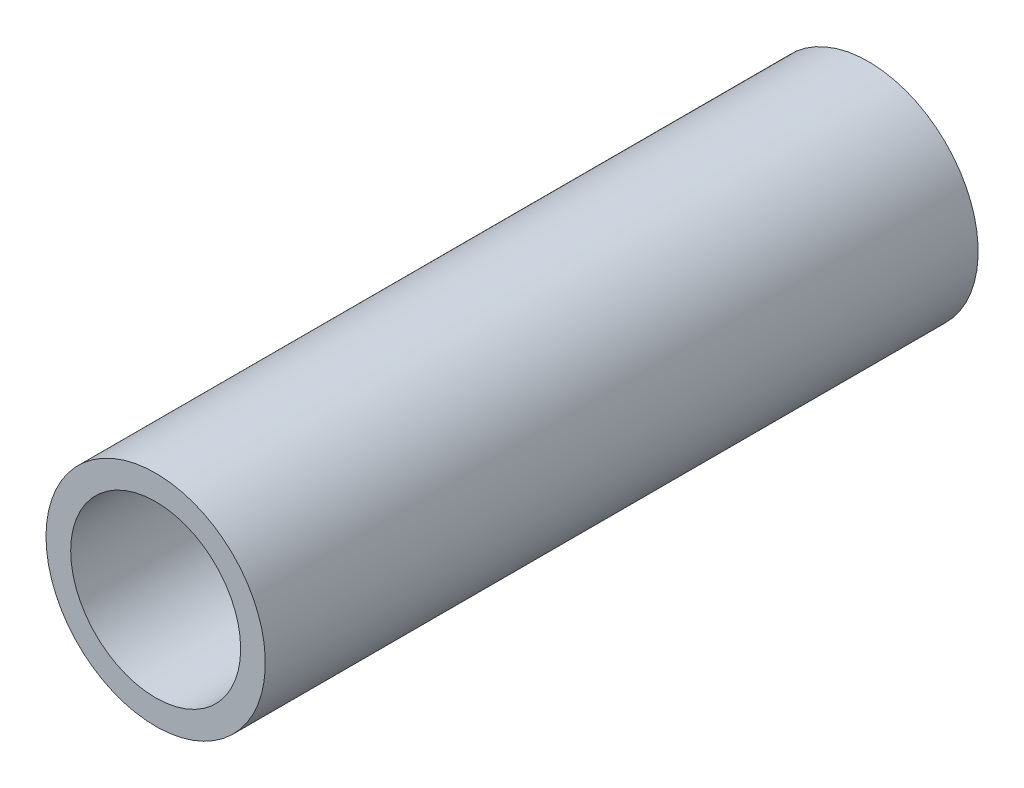
ISO-10303-21;
HEADER;
FILE_DESCRIPTION(('STEP AP214'),'2;1');
FILE_NAME('part.step','',(''),(''),'','','');
FILE_SCHEMA(('AUTOMOTIVE_DESIGN { 1 0 10303 214 1 1 1 1 }'));
ENDSEC;
DATA;
#1=APPLICATION_CONTEXT('core data for automotive mechanical design processes');
#2=APPLICATION_PROTOCOL_DEFINITION('international standard','automotive_design',2000,#1);
#3=PRODUCT_CONTEXT('',#1,'mechanical');
#4=PRODUCT('Part','Part','',(#3));
#5=PRODUCT_RELATED_PRODUCT_CATEGORY('part','',(#4));
#6=PRODUCT_DEFINITION_FORMATION('','',#4);
#7=PRODUCT_DEFINITION_CONTEXT('part definition',#1,'design');
#8=PRODUCT_DEFINITION('design','',#6,#7);
#9=PRODUCT_DEFINITION_SHAPE('','',#8);
#10=(LENGTH_UNIT() NAMED_UNIT(*) SI_UNIT(.MILLI.,.METRE.));
#11=(NAMED_UNIT(*) PLANE_ANGLE_UNIT() SI_UNIT($,.RADIAN.));
#12=(NAMED_UNIT(*) SI_UNIT($,.STERADIAN.) SOLID_ANGLE_UNIT());
#13=UNCERTAINTY_MEASURE_WITH_UNIT(LENGTH_MEASURE(1.E-05),#10,'distance_accuracy_value','');
#14=(GEOMETRIC_REPRESENTATION_CONTEXT(3) GLOBAL_UNCERTAINTY_ASSIGNED_CONTEXT((#13)) GLOBAL_UNIT_ASSIGNED_CONTEXT((#10,
#11,#12)) REPRESENTATION_CONTEXT('',''));
#15=CARTESIAN_POINT('',(0.,0.,0.));
#16=DIRECTION('',(0.,0.,1.));
#17=DIRECTION('',(1.,0.,0.));
#18=AXIS2_PLACEMENT_3D('',#15,#16,#17);
#19=CARTESIAN_POINT('',(0.,0.,6.5));
#20=DIRECTION('',(0.,0.,1.));
#21=DIRECTION('',(1.,0.,0.));
#22=AXIS2_PLACEMENT_3D('',#19,#20,#21);
#23=PLANE('',#22);
#24=CARTESIAN_POINT('',(0.,0.,6.5));
#25=DIRECTION('',(0.,0.,1.));
#26=DIRECTION('',(1.,0.,0.));
#27=AXIS2_PLACEMENT_3D('',#24,#25,#26);
#28=CIRCLE('',#27,1.);
#29=CARTESIAN_POINT('',(-1.,0.,6.5));
#30=VERTEX_POINT('',#29);
#31=EDGE_CURVE('E10',#30,#30,#28,.T.);
#32=ORIENTED_EDGE('',*,*,#31,.T.);
#33=EDGE_LOOP('',(#32));
#34=FACE_BOUND('',#33,.T.);
#35=CARTESIAN_POINT('',(0.,0.,6.5));
#36=DIRECTION('',(0.,0.,1.));
#37=DIRECTION('',(1.,0.,0.));
#38=AXIS2_PLACEMENT_3D('',#35,#36,#37);
#39=CIRCLE('',#38,0.775);
#40=CARTESIAN_POINT('',(-0.775,0.,6.5));
#41=VERTEX_POINT('',#40);
#42=EDGE_CURVE('E43',#41,#41,#39,.T.);
#43=ORIENTED_EDGE('',*,*,#42,.F.);
#44=EDGE_LOOP('',(#43));
#45=FACE_BOUND('',#44,.T.);
#46=ADVANCED_FACE('F32',(#34,#45),#23,.T.);
#47=CARTESIAN_POINT('',(0.,0.,0.));
#48=DIRECTION('',(0.,0.,1.));
#49=DIRECTION('',(1.,0.,0.));
#50=AXIS2_PLACEMENT_3D('',#47,#48,#49);
#51=PLANE('',#50);
#52=CARTESIAN_POINT('',(0.,0.,0.));
#53=DIRECTION('',(0.,0.,1.));
#54=DIRECTION('',(1.,0.,0.));
#55=AXIS2_PLACEMENT_3D('',#52,#53,#54);
#56=CIRCLE('',#55,1.);
#57=CARTESIAN_POINT('',(-1.,0.,0.));
#58=VERTEX_POINT('',#57);
#59=EDGE_CURVE('E36',#58,#58,#56,.T.);
#60=ORIENTED_EDGE('',*,*,#59,.F.);
#61=EDGE_LOOP('',(#60));
#62=FACE_BOUND('',#61,.T.);
#63=CARTESIAN_POINT('',(0.,0.,0.));
#64=DIRECTION('',(0.,0.,1.));
#65=DIRECTION('',(1.,0.,0.));
#66=AXIS2_PLACEMENT_3D('',#63,#64,#65);
#67=CIRCLE('',#66,0.775);
#68=CARTESIAN_POINT('',(-0.775,0.,0.));
#69=VERTEX_POINT('',#68);
#70=EDGE_CURVE('E45',#69,#69,#67,.T.);
#71=ORIENTED_EDGE('',*,*,#70,.T.);
#72=EDGE_LOOP('',(#71));
#73=FACE_BOUND('',#72,.T.);
#74=ADVANCED_FACE('F55',(#62,#73),#51,.F.);
#75=CARTESIAN_POINT('',(0.,0.,6.5));
#76=DIRECTION('',(0.,0.,-1.));
#77=DIRECTION('',(-1.,0.,0.));
#78=AXIS2_PLACEMENT_3D('',#75,#76,#77);
#79=CYLINDRICAL_SURFACE('',#78,1.);
#80=CARTESIAN_POINT('',(-1.,0.,6.5));
#81=CARTESIAN_POINT('',(-1.,0.,6.43229166666667));
#82=CARTESIAN_POINT('',(-1.,0.,6.36458333333333));
#83=CARTESIAN_POINT('',(-1.,0.,6.22916666666667));
#84=CARTESIAN_POINT('',(-1.,0.,6.16145833333333));
#85=CARTESIAN_POINT('',(-1.,0.,6.02604166666667));
#86=CARTESIAN_POINT('',(-1.,0.,5.95833333333333));
#87=CARTESIAN_POINT('',(-1.,0.,5.82291666666667));
#88=CARTESIAN_POINT('',(-1.,0.,5.75520833333333));
#89=CARTESIAN_POINT('',(-1.,0.,5.61979166666667));
#90=CARTESIAN_POINT('',(-1.,0.,5.55208333333333));
#91=CARTESIAN_POINT('',(-1.,0.,5.41666666666667));
#92=CARTESIAN_POINT('',(-1.,0.,5.34895833333333));
#93=CARTESIAN_POINT('',(-1.,0.,5.21354166666667));
#94=CARTESIAN_POINT('',(-1.,0.,5.14583333333333));
#95=CARTESIAN_POINT('',(-1.,0.,5.01041666666667));
#96=CARTESIAN_POINT('',(-1.,0.,4.94270833333333));
#97=CARTESIAN_POINT('',(-1.,0.,4.80729166666667));
#98=CARTESIAN_POINT('',(-1.,0.,4.73958333333333));
#99=CARTESIAN_POINT('',(-1.,0.,4.60416666666667));
#100=CARTESIAN_POINT('',(-1.,0.,4.53645833333333));
#101=CARTESIAN_POINT('',(-1.,0.,4.40104166666667));
#102=CARTESIAN_POINT('',(-1.,0.,4.33333333333333));
#103=CARTESIAN_POINT('',(-1.,0.,4.19791666666667));
#104=CARTESIAN_POINT('',(-1.,0.,4.13020833333333));
#105=CARTESIAN_POINT('',(-1.,0.,3.99479166666667));
#106=CARTESIAN_POINT('',(-1.,0.,3.92708333333333));
#107=CARTESIAN_POINT('',(-1.,0.,3.79166666666667));
#108=CARTESIAN_POINT('',(-1.,0.,3.72395833333333));
#109=CARTESIAN_POINT('',(-1.,0.,3.58854166666667));
#110=CARTESIAN_POINT('',(-1.,0.,3.52083333333333));
#111=CARTESIAN_POINT('',(-1.,0.,3.38541666666667));
#112=CARTESIAN_POINT('',(-1.,0.,3.31770833333333));
#113=CARTESIAN_POINT('',(-1.,0.,3.18229166666667));
#114=CARTESIAN_POINT('',(-1.,0.,3.11458333333333));
#115=CARTESIAN_POINT('',(-1.,0.,2.97916666666667));
#116=CARTESIAN_POINT('',(-1.,0.,2.91145833333333));
#117=CARTESIAN_POINT('',(-1.,0.,2.77604166666667));
#118=CARTESIAN_POINT('',(-1.,0.,2.70833333333333));
#119=CARTESIAN_POINT('',(-1.,0.,2.57291666666667));
#120=CARTESIAN_POINT('',(-1.,0.,2.50520833333333));
#121=CARTESIAN_POINT('',(-1.,0.,2.36979166666667));
#122=CARTESIAN_POINT('',(-1.,0.,2.30208333333333));
#123=CARTESIAN_POINT('',(-1.,0.,2.16666666666667));
#124=CARTESIAN_POINT('',(-1.,0.,2.09895833333333));
#125=CARTESIAN_POINT('',(-1.,0.,1.96354166666667));
#126=CARTESIAN_POINT('',(-1.,0.,1.89583333333333));
#127=CARTESIAN_POINT('',(-1.,0.,1.76041666666667));
#128=CARTESIAN_POINT('',(-1.,0.,1.69270833333333));
#129=CARTESIAN_POINT('',(-1.,0.,1.55729166666667));
#130=CARTESIAN_POINT('',(-1.,0.,1.48958333333333));
#131=CARTESIAN_POINT('',(-1.,0.,1.35416666666667));
#132=CARTESIAN_POINT('',(-1.,0.,1.28645833333333));
#133=CARTESIAN_POINT('',(-1.,0.,1.15104166666667));
#134=CARTESIAN_POINT('',(-1.,0.,1.08333333333333));
#135=CARTESIAN_POINT('',(-1.,0.,0.947916666666667));
#136=CARTESIAN_POINT('',(-1.,0.,0.880208333333333));
#137=CARTESIAN_POINT('',(-1.,0.,0.744791666666667));
#138=CARTESIAN_POINT('',(-1.,0.,0.677083333333333));
#139=CARTESIAN_POINT('',(-1.,0.,0.541666666666667));
#140=CARTESIAN_POINT('',(-1.,0.,0.473958333333333));
#141=CARTESIAN_POINT('',(-1.,0.,0.338541666666667));
#142=CARTESIAN_POINT('',(-1.,0.,0.270833333333334));
#143=CARTESIAN_POINT('',(-1.,0.,0.135416666666667));
#144=CARTESIAN_POINT('',(-1.,0.,0.0677083333333334));
#145=CARTESIAN_POINT('',(-1.,0.,0.));
#146=B_SPLINE_CURVE_WITH_KNOTS('',3,(#80,#81,#82,#83,#84,#85,#86,#87,#88,#89,#90,#91,#92,#93,
#94,#95,#96,#97,#98,#99,#100,#101,#102,#103,#104,#105,#106,#107,#108,#109,#110,#111,#112,#113,
#114,#115,#116,#117,#118,#119,#120,#121,#122,#123,#124,#125,#126,#127,#128,#129,#130,#131,#132,
#133,#134,#135,#136,#137,#138,#139,#140,#141,#142,#143,#144,#145),.UNSPECIFIED.,.F.,.F.,(4,2,2,
2,2,2,2,2,2,2,2,2,2,2,2,2,2,2,2,2,2,2,2,2,2,2,2,2,2,2,2,2,4),(0.,0.203125,0.40625,
0.609375000000001,0.812500000000001,1.015625,1.21875,1.421875,1.625,1.828125,2.03125,2.234375,
2.4375,2.640625,2.84375,3.046875,3.25,3.453125,3.65625,3.859375,4.0625,4.265625,4.46875,
4.671875,4.875,5.078125,5.28125,5.484375,5.6875,5.890625,6.09375,6.296875,6.5),.UNSPECIFIED.);
#147=EDGE_CURVE('BSEAM34',#30,#58,#146,.T.);
#148=ORIENTED_EDGE('',*,*,#31,.F.);
#149=ORIENTED_EDGE('',*,*,#59,.T.);
#150=ORIENTED_EDGE('',*,*,#147,.T.);
#151=ORIENTED_EDGE('',*,*,#147,.F.);
#152=EDGE_LOOP('',(#148,#150,#149,#151));
#153=FACE_BOUND('',#152,.T.);
#154=ADVANCED_FACE('F34',(#153),#79,.T.);
#155=CARTESIAN_POINT('',(0.,0.,6.5));
#156=DIRECTION('',(0.,0.,-1.));
#157=DIRECTION('',(-1.,0.,0.));
#158=AXIS2_PLACEMENT_3D('',#155,#156,#157);
#159=CYLINDRICAL_SURFACE('',#158,0.775);
#160=CARTESIAN_POINT('',(-0.775,0.,6.5));
#161=CARTESIAN_POINT('',(-0.775,0.,6.43229166666667));
#162=CARTESIAN_POINT('',(-0.775,0.,6.36458333333333));
#163=CARTESIAN_POINT('',(-0.775,0.,6.22916666666667));
#164=CARTESIAN_POINT('',(-0.775,0.,6.16145833333333));
#165=CARTESIAN_POINT('',(-0.775,0.,6.02604166666667));
#166=CARTESIAN_POINT('',(-0.775,0.,5.95833333333333));
#167=CARTESIAN_POINT('',(-0.775,0.,5.82291666666667));
#168=CARTESIAN_POINT('',(-0.775,0.,5.75520833333333));
#169=CARTESIAN_POINT('',(-0.775,0.,5.61979166666667));
#170=CARTESIAN_POINT('',(-0.775,0.,5.55208333333333));
#171=CARTESIAN_POINT('',(-0.775,0.,5.41666666666667));
#172=CARTESIAN_POINT('',(-0.775,0.,5.34895833333333));
#173=CARTESIAN_POINT('',(-0.775,0.,5.21354166666667));
#174=CARTESIAN_POINT('',(-0.775,0.,5.14583333333333));
#175=CARTESIAN_POINT('',(-0.775,0.,5.01041666666667));
#176=CARTESIAN_POINT('',(-0.775,0.,4.94270833333333));
#177=CARTESIAN_POINT('',(-0.775,0.,4.80729166666667));
#178=CARTESIAN_POINT('',(-0.775,0.,4.73958333333333));
#179=CARTESIAN_POINT('',(-0.775,0.,4.60416666666667));
#180=CARTESIAN_POINT('',(-0.775,0.,4.53645833333333));
#181=CARTESIAN_POINT('',(-0.775,0.,4.40104166666667));
#182=CARTESIAN_POINT('',(-0.775,0.,4.33333333333333));
#183=CARTESIAN_POINT('',(-0.775,0.,4.19791666666667));
#184=CARTESIAN_POINT('',(-0.775,0.,4.13020833333333));
#185=CARTESIAN_POINT('',(-0.775,0.,3.99479166666667));
#186=CARTESIAN_POINT('',(-0.775,0.,3.92708333333333));
#187=CARTESIAN_POINT('',(-0.775,0.,3.79166666666667));
#188=CARTESIAN_POINT('',(-0.775,0.,3.72395833333333));
#189=CARTESIAN_POINT('',(-0.775,0.,3.58854166666667));
#190=CARTESIAN_POINT('',(-0.775,0.,3.52083333333333));
#191=CARTESIAN_POINT('',(-0.775,0.,3.38541666666667));
#192=CARTESIAN_POINT('',(-0.775,0.,3.31770833333333));
#193=CARTESIAN_POINT('',(-0.775,0.,3.18229166666667));
#194=CARTESIAN_POINT('',(-0.775,0.,3.11458333333333));
#195=CARTESIAN_POINT('',(-0.775,0.,2.97916666666667));
#196=CARTESIAN_POINT('',(-0.775,0.,2.91145833333333));
#197=CARTESIAN_POINT('',(-0.775,0.,2.77604166666667));
#198=CARTESIAN_POINT('',(-0.775,0.,2.70833333333333));
#199=CARTESIAN_POINT('',(-0.775,0.,2.57291666666667));
#200=CARTESIAN_POINT('',(-0.775,0.,2.50520833333333));
#201=CARTESIAN_POINT('',(-0.775,0.,2.36979166666667));
#202=CARTESIAN_POINT('',(-0.775,0.,2.30208333333333));
#203=CARTESIAN_POINT('',(-0.775,0.,2.16666666666667));
#204=CARTESIAN_POINT('',(-0.775,0.,2.09895833333333));
#205=CARTESIAN_POINT('',(-0.775,0.,1.96354166666667));
#206=CARTESIAN_POINT('',(-0.775,0.,1.89583333333333));
#207=CARTESIAN_POINT('',(-0.775,0.,1.76041666666667));
#208=CARTESIAN_POINT('',(-0.775,0.,1.69270833333333));
#209=CARTESIAN_POINT('',(-0.775,0.,1.55729166666667));
#210=CARTESIAN_POINT('',(-0.775,0.,1.48958333333333));
#211=CARTESIAN_POINT('',(-0.775,0.,1.35416666666667));
#212=CARTESIAN_POINT('',(-0.775,0.,1.28645833333333));
#213=CARTESIAN_POINT('',(-0.775,0.,1.15104166666667));
#214=CARTESIAN_POINT('',(-0.775,0.,1.08333333333333));
#215=CARTESIAN_POINT('',(-0.775,0.,0.947916666666667));
#216=CARTESIAN_POINT('',(-0.775,0.,0.880208333333333));
#217=CARTESIAN_POINT('',(-0.775,0.,0.744791666666667));
#218=CARTESIAN_POINT('',(-0.775,0.,0.677083333333333));
#219=CARTESIAN_POINT('',(-0.775,0.,0.541666666666667));
#220=CARTESIAN_POINT('',(-0.775,0.,0.473958333333333));
#221=CARTESIAN_POINT('',(-0.775,0.,0.338541666666667));
#222=CARTESIAN_POINT('',(-0.775,0.,0.270833333333334));
#223=CARTESIAN_POINT('',(-0.775,0.,0.135416666666667));
#224=CARTESIAN_POINT('',(-0.775,0.,0.0677083333333334));
#225=CARTESIAN_POINT('',(-0.775,0.,0.));
#226=B_SPLINE_CURVE_WITH_KNOTS('',3,(#160,#161,#162,#163,#164,#165,#166,#167,#168,#169,#170,
#171,#172,#173,#174,#175,#176,#177,#178,#179,#180,#181,#182,#183,#184,#185,#186,#187,#188,#189,
#190,#191,#192,#193,#194,#195,#196,#197,#198,#199,#200,#201,#202,#203,#204,#205,#206,#207,#208,
#209,#210,#211,#212,#213,#214,#215,#216,#217,#218,#219,#220,#221,#222,#223,#224,#225),
.UNSPECIFIED.,.F.,.F.,(4,2,2,2,2,2,2,2,2,2,2,2,2,2,2,2,2,2,2,2,2,2,2,2,2,2,2,2,2,2,2,2,4),(0.,
0.203124999999999,0.40625,0.609375,0.812499999999999,1.015625,1.21875,1.421875,1.625,1.828125,
2.03125,2.234375,2.4375,2.640625,2.84375,3.046875,3.25,3.453125,3.65625,3.859375,4.0625,
4.265625,4.46875,4.671875,4.875,5.078125,5.28125,5.484375,5.6875,5.890625,6.09375,6.296875,6.5),.UNSPECIFIED.);
#227=EDGE_CURVE('BSEAM51',#41,#69,#226,.T.);
#228=ORIENTED_EDGE('',*,*,#42,.T.);
#229=ORIENTED_EDGE('',*,*,#70,.F.);
#230=ORIENTED_EDGE('',*,*,#227,.T.);
#231=ORIENTED_EDGE('',*,*,#227,.F.);
#232=EDGE_LOOP('',(#228,#230,#229,#231));
#233=FACE_BOUND('',#232,.T.);
#234=ADVANCED_FACE('F51',(#233),#159,.F.);
#235=CLOSED_SHELL('',(#46,#74,#154,#234));
#236=MANIFOLD_SOLID_BREP('B2',#235);
#237=ADVANCED_BREP_SHAPE_REPRESENTATION('',(#18,#236),#14);
#238=SHAPE_DEFINITION_REPRESENTATION(#9,#237);
ENDSEC;
END-ISO-10303-21;
